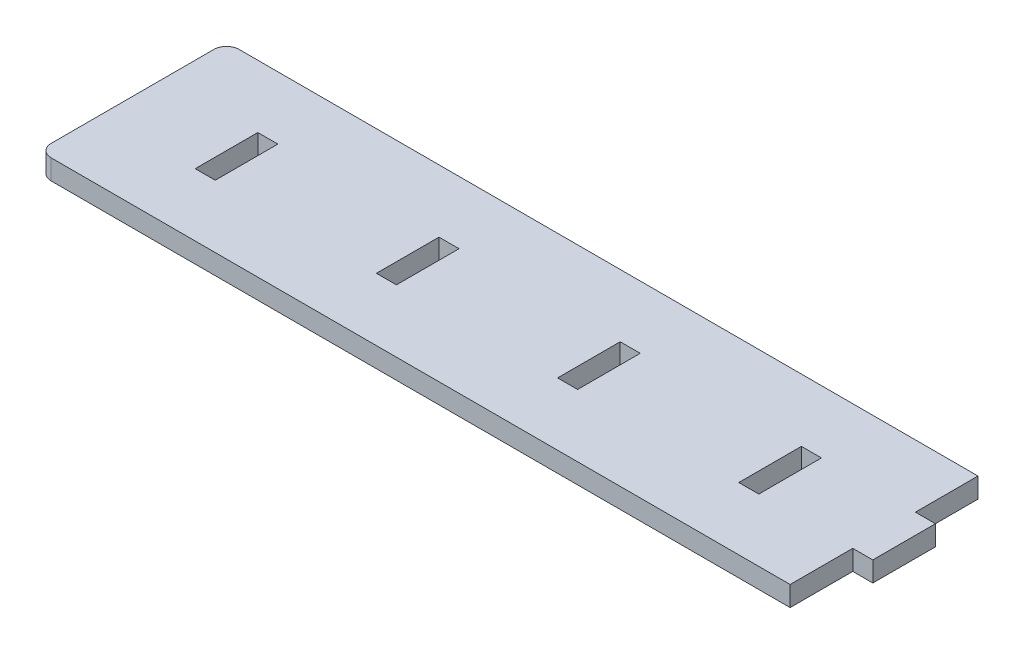
ISO-10303-21;
HEADER;
FILE_DESCRIPTION(('STEP AP214'),'2;1');
FILE_NAME('part.step','',(''),(''),'','','');
FILE_SCHEMA(('AUTOMOTIVE_DESIGN { 1 0 10303 214 1 1 1 1 }'));
ENDSEC;
DATA;
#1=APPLICATION_CONTEXT('core data for automotive mechanical design processes');
#2=APPLICATION_PROTOCOL_DEFINITION('international standard','automotive_design',2000,#1);
#3=PRODUCT_CONTEXT('',#1,'mechanical');
#4=PRODUCT('Part','Part','',(#3));
#5=PRODUCT_RELATED_PRODUCT_CATEGORY('part','',(#4));
#6=PRODUCT_DEFINITION_FORMATION('','',#4);
#7=PRODUCT_DEFINITION_CONTEXT('part definition',#1,'design');
#8=PRODUCT_DEFINITION('design','',#6,#7);
#9=PRODUCT_DEFINITION_SHAPE('','',#8);
#10=(LENGTH_UNIT() NAMED_UNIT(*) SI_UNIT(.MILLI.,.METRE.));
#11=(NAMED_UNIT(*) PLANE_ANGLE_UNIT() SI_UNIT($,.RADIAN.));
#12=(NAMED_UNIT(*) SI_UNIT($,.STERADIAN.) SOLID_ANGLE_UNIT());
#13=UNCERTAINTY_MEASURE_WITH_UNIT(LENGTH_MEASURE(1.E-05),#10,'distance_accuracy_value','');
#14=(GEOMETRIC_REPRESENTATION_CONTEXT(3) GLOBAL_UNCERTAINTY_ASSIGNED_CONTEXT((#13)) GLOBAL_UNIT_ASSIGNED_CONTEXT((#10,
#11,#12)) REPRESENTATION_CONTEXT('',''));
#15=CARTESIAN_POINT('',(0.,0.,0.));
#16=DIRECTION('',(0.,0.,1.));
#17=DIRECTION('',(1.,0.,0.));
#18=AXIS2_PLACEMENT_3D('',#15,#16,#17);
#19=CARTESIAN_POINT('',(0.,3.2,0.));
#20=DIRECTION('',(0.,-1.,0.));
#21=DIRECTION('',(0.,0.,-1.));
#22=AXIS2_PLACEMENT_3D('',#19,#20,#21);
#23=PLANE('',#22);
#24=DIRECTION('',(1.,0.,0.));
#25=VECTOR('',#24,1.);
#26=CARTESIAN_POINT('',(-16.0666666666667,3.2,5.));
#27=LINE('',#26,#25);
#28=CARTESIAN_POINT('',(-16.0666666666667,3.2,5.));
#29=VERTEX_POINT('',#28);
#30=CARTESIAN_POINT('',(-12.8666666666667,3.2,5.));
#31=VERTEX_POINT('',#30);
#32=EDGE_CURVE('E252',#29,#31,#27,.T.);
#33=ORIENTED_EDGE('',*,*,#32,.F.);
#34=DIRECTION('',(0.,0.,1.));
#35=VECTOR('',#34,1.);
#36=CARTESIAN_POINT('',(-16.0666666666667,3.2,-5.));
#37=LINE('',#36,#35);
#38=CARTESIAN_POINT('',(-16.0666666666667,3.2,-5.));
#39=VERTEX_POINT('',#38);
#40=EDGE_CURVE('E260',#39,#29,#37,.T.);
#41=ORIENTED_EDGE('',*,*,#40,.F.);
#42=DIRECTION('',(-1.,0.,0.));
#43=VECTOR('',#42,1.);
#44=CARTESIAN_POINT('',(-16.0666666666667,3.2,-5.));
#45=LINE('',#44,#43);
#46=CARTESIAN_POINT('',(-12.8666666666667,3.2,-5.));
#47=VERTEX_POINT('',#46);
#48=EDGE_CURVE('E257',#47,#39,#45,.T.);
#49=ORIENTED_EDGE('',*,*,#48,.F.);
#50=DIRECTION('',(0.,0.,-1.));
#51=VECTOR('',#50,1.);
#52=CARTESIAN_POINT('',(-12.8666666666667,3.2,-5.));
#53=LINE('',#52,#51);
#54=EDGE_CURVE('E254',#31,#47,#53,.T.);
#55=ORIENTED_EDGE('',*,*,#54,.F.);
#56=EDGE_LOOP('',(#33,#41,#49,#55));
#57=FACE_BOUND('',#56,.T.);
#58=DIRECTION('',(0.,0.,-1.));
#59=VECTOR('',#58,1.);
#60=CARTESIAN_POINT('',(-41.8,3.2,-5.));
#61=LINE('',#60,#59);
#62=CARTESIAN_POINT('',(-41.8,3.2,5.));
#63=VERTEX_POINT('',#62);
#64=CARTESIAN_POINT('',(-41.8,3.2,-5.));
#65=VERTEX_POINT('',#64);
#66=EDGE_CURVE('E314',#63,#65,#61,.T.);
#67=ORIENTED_EDGE('',*,*,#66,.F.);
#68=DIRECTION('',(1.,0.,0.));
#69=VECTOR('',#68,1.);
#70=CARTESIAN_POINT('',(-45.,3.2,5.));
#71=LINE('',#70,#69);
#72=CARTESIAN_POINT('',(-45.,3.2,5.));
#73=VERTEX_POINT('',#72);
#74=EDGE_CURVE('E322',#73,#63,#71,.T.);
#75=ORIENTED_EDGE('',*,*,#74,.F.);
#76=DIRECTION('',(0.,0.,1.));
#77=VECTOR('',#76,1.);
#78=CARTESIAN_POINT('',(-45.,3.2,-5.));
#79=LINE('',#78,#77);
#80=CARTESIAN_POINT('',(-45.,3.2,-5.));
#81=VERTEX_POINT('',#80);
#82=EDGE_CURVE('E319',#81,#73,#79,.T.);
#83=ORIENTED_EDGE('',*,*,#82,.F.);
#84=DIRECTION('',(-1.,0.,0.));
#85=VECTOR('',#84,1.);
#86=CARTESIAN_POINT('',(-45.,3.2,-5.));
#87=LINE('',#86,#85);
#88=EDGE_CURVE('E316',#65,#81,#87,.T.);
#89=ORIENTED_EDGE('',*,*,#88,.F.);
#90=EDGE_LOOP('',(#67,#75,#83,#89));
#91=FACE_BOUND('',#90,.T.);
#92=DIRECTION('',(-1.,0.,0.));
#93=VECTOR('',#92,1.);
#94=CARTESIAN_POINT('',(-60.,3.2,-15.));
#95=LINE('',#94,#93);
#96=CARTESIAN_POINT('',(60.,3.2,-15.));
#97=VERTEX_POINT('',#96);
#98=CARTESIAN_POINT('',(-58.,3.2,-15.));
#99=VERTEX_POINT('',#98);
#100=EDGE_CURVE('E357',#97,#99,#95,.T.);
#101=ORIENTED_EDGE('',*,*,#100,.T.);
#102=CARTESIAN_POINT('',(-58.,3.2,-13.));
#103=DIRECTION('',(0.,-1.,0.));
#104=DIRECTION('',(0.,0.,-1.));
#105=AXIS2_PLACEMENT_3D('',#102,#103,#104);
#106=CIRCLE('',#105,2.);
#107=CARTESIAN_POINT('',(-60.,3.2,-13.));
#108=VERTEX_POINT('',#107);
#109=EDGE_CURVE('E42',#99,#108,#106,.F.);
#110=ORIENTED_EDGE('',*,*,#109,.T.);
#111=DIRECTION('',(0.,0.,1.));
#112=VECTOR('',#111,1.);
#113=CARTESIAN_POINT('',(-60.,3.2,-15.));
#114=LINE('',#113,#112);
#115=CARTESIAN_POINT('',(-60.,3.2,13.));
#116=VERTEX_POINT('',#115);
#117=EDGE_CURVE('E359',#108,#116,#114,.T.);
#118=ORIENTED_EDGE('',*,*,#117,.T.);
#119=CARTESIAN_POINT('',(-58.,3.2,13.));
#120=DIRECTION('',(0.,-1.,0.));
#121=DIRECTION('',(0.,0.,-1.));
#122=AXIS2_PLACEMENT_3D('',#119,#120,#121);
#123=CIRCLE('',#122,2.);
#124=CARTESIAN_POINT('',(-58.,3.2,15.));
#125=VERTEX_POINT('',#124);
#126=EDGE_CURVE('E49',#116,#125,#123,.F.);
#127=ORIENTED_EDGE('',*,*,#126,.T.);
#128=DIRECTION('',(1.,0.,0.));
#129=VECTOR('',#128,1.);
#130=CARTESIAN_POINT('',(-60.,3.2,15.));
#131=LINE('',#130,#129);
#132=CARTESIAN_POINT('',(60.,3.2,15.));
#133=VERTEX_POINT('',#132);
#134=EDGE_CURVE('E361',#125,#133,#131,.T.);
#135=ORIENTED_EDGE('',*,*,#134,.T.);
#136=DIRECTION('',(0.,0.,-1.));
#137=VECTOR('',#136,1.);
#138=CARTESIAN_POINT('',(60.,3.2,15.));
#139=LINE('',#138,#137);
#140=CARTESIAN_POINT('',(60.,3.2,4.99999999999999));
#141=VERTEX_POINT('',#140);
#142=EDGE_CURVE('E345',#133,#141,#139,.T.);
#143=ORIENTED_EDGE('',*,*,#142,.T.);
#144=DIRECTION('',(1.,0.,0.));
#145=VECTOR('',#144,1.);
#146=CARTESIAN_POINT('',(60.,3.2,4.99999999999999));
#147=LINE('',#146,#145);
#148=CARTESIAN_POINT('',(63.2,3.2,4.99999999999999));
#149=VERTEX_POINT('',#148);
#150=EDGE_CURVE('E348',#141,#149,#147,.T.);
#151=ORIENTED_EDGE('',*,*,#150,.T.);
#152=DIRECTION('',(0.,0.,-1.));
#153=VECTOR('',#152,1.);
#154=CARTESIAN_POINT('',(63.2,3.2,4.99999999999999));
#155=LINE('',#154,#153);
#156=CARTESIAN_POINT('',(63.2,3.2,-5.00000000000001));
#157=VERTEX_POINT('',#156);
#158=EDGE_CURVE('E351',#149,#157,#155,.T.);
#159=ORIENTED_EDGE('',*,*,#158,.T.);
#160=DIRECTION('',(-1.,0.,0.));
#161=VECTOR('',#160,1.);
#162=CARTESIAN_POINT('',(63.2,3.2,-5.00000000000001));
#163=LINE('',#162,#161);
#164=CARTESIAN_POINT('',(60.,3.2,-5.00000000000001));
#165=VERTEX_POINT('',#164);
#166=EDGE_CURVE('E353',#157,#165,#163,.T.);
#167=ORIENTED_EDGE('',*,*,#166,.T.);
#168=DIRECTION('',(0.,0.,-1.));
#169=VECTOR('',#168,1.);
#170=CARTESIAN_POINT('',(60.,3.2,-5.00000000000001));
#171=LINE('',#170,#169);
#172=EDGE_CURVE('E355',#165,#97,#171,.T.);
#173=ORIENTED_EDGE('',*,*,#172,.T.);
#174=EDGE_LOOP('',(#101,#110,#118,#127,#135,#143,#151,#159,#167,#173));
#175=FACE_BOUND('',#174,.T.);
#176=DIRECTION('',(1.,0.,0.));
#177=VECTOR('',#176,1.);
#178=CARTESIAN_POINT('',(12.8666666666666,3.2,5.));
#179=LINE('',#178,#177);
#180=CARTESIAN_POINT('',(12.8666666666666,3.2,5.));
#181=VERTEX_POINT('',#180);
#182=CARTESIAN_POINT('',(16.0666666666666,3.2,5.));
#183=VERTEX_POINT('',#182);
#184=EDGE_CURVE('E283',#181,#183,#179,.T.);
#185=ORIENTED_EDGE('',*,*,#184,.F.);
#186=DIRECTION('',(0.,0.,1.));
#187=VECTOR('',#186,1.);
#188=CARTESIAN_POINT('',(12.8666666666666,3.2,-5.));
#189=LINE('',#188,#187);
#190=CARTESIAN_POINT('',(12.8666666666666,3.2,-5.));
#191=VERTEX_POINT('',#190);
#192=EDGE_CURVE('E291',#191,#181,#189,.T.);
#193=ORIENTED_EDGE('',*,*,#192,.F.);
#194=DIRECTION('',(-1.,0.,0.));
#195=VECTOR('',#194,1.);
#196=CARTESIAN_POINT('',(12.8666666666666,3.2,-5.));
#197=LINE('',#196,#195);
#198=CARTESIAN_POINT('',(16.0666666666666,3.2,-5.));
#199=VERTEX_POINT('',#198);
#200=EDGE_CURVE('E288',#199,#191,#197,.T.);
#201=ORIENTED_EDGE('',*,*,#200,.F.);
#202=DIRECTION('',(0.,0.,-1.));
#203=VECTOR('',#202,1.);
#204=CARTESIAN_POINT('',(16.0666666666666,3.2,-5.));
#205=LINE('',#204,#203);
#206=EDGE_CURVE('E285',#183,#199,#205,.T.);
#207=ORIENTED_EDGE('',*,*,#206,.F.);
#208=EDGE_LOOP('',(#185,#193,#201,#207));
#209=FACE_BOUND('',#208,.T.);
#210=DIRECTION('',(1.,0.,0.));
#211=VECTOR('',#210,1.);
#212=CARTESIAN_POINT('',(41.8,3.2,5.));
#213=LINE('',#212,#211);
#214=CARTESIAN_POINT('',(41.8,3.2,5.));
#215=VERTEX_POINT('',#214);
#216=CARTESIAN_POINT('',(45.,3.2,5.));
#217=VERTEX_POINT('',#216);
#218=EDGE_CURVE('E211',#215,#217,#213,.T.);
#219=ORIENTED_EDGE('',*,*,#218,.F.);
#220=DIRECTION('',(0.,0.,1.));
#221=VECTOR('',#220,1.);
#222=CARTESIAN_POINT('',(41.8,3.2,-5.));
#223=LINE('',#222,#221);
#224=CARTESIAN_POINT('',(41.8,3.2,-5.));
#225=VERTEX_POINT('',#224);
#226=EDGE_CURVE('E236',#225,#215,#223,.T.);
#227=ORIENTED_EDGE('',*,*,#226,.F.);
#228=DIRECTION('',(-1.,0.,0.));
#229=VECTOR('',#228,1.);
#230=CARTESIAN_POINT('',(41.8,3.2,-5.));
#231=LINE('',#230,#229);
#232=CARTESIAN_POINT('',(45.,3.2,-5.00000000000002));
#233=VERTEX_POINT('',#232);
#234=EDGE_CURVE('E234',#233,#225,#231,.T.);
#235=ORIENTED_EDGE('',*,*,#234,.F.);
#236=DIRECTION('',(0.,0.,-1.));
#237=VECTOR('',#236,1.);
#238=CARTESIAN_POINT('',(45.,3.2,-5.00000000000002));
#239=LINE('',#238,#237);
#240=EDGE_CURVE('E221',#217,#233,#239,.T.);
#241=ORIENTED_EDGE('',*,*,#240,.F.);
#242=EDGE_LOOP('',(#219,#227,#235,#241));
#243=FACE_BOUND('',#242,.T.);
#244=ADVANCED_FACE('F34',(#57,#91,#175,#209,#243),#23,.F.);
#245=CARTESIAN_POINT('',(0.,0.,0.));
#246=DIRECTION('',(0.,-1.,0.));
#247=DIRECTION('',(0.,0.,-1.));
#248=AXIS2_PLACEMENT_3D('',#245,#246,#247);
#249=PLANE('',#248);
#250=DIRECTION('',(0.,0.,1.));
#251=VECTOR('',#250,1.);
#252=CARTESIAN_POINT('',(-60.,0.,-15.));
#253=LINE('',#252,#251);
#254=CARTESIAN_POINT('',(-60.,0.,-13.));
#255=VERTEX_POINT('',#254);
#256=CARTESIAN_POINT('',(-60.,0.,13.));
#257=VERTEX_POINT('',#256);
#258=EDGE_CURVE('E376',#255,#257,#253,.T.);
#259=ORIENTED_EDGE('',*,*,#258,.F.);
#260=CARTESIAN_POINT('',(-58.,0.,-13.));
#261=DIRECTION('',(0.,-1.,0.));
#262=DIRECTION('',(0.,0.,-1.));
#263=AXIS2_PLACEMENT_3D('',#260,#261,#262);
#264=CIRCLE('',#263,2.);
#265=CARTESIAN_POINT('',(-58.,0.,-15.));
#266=VERTEX_POINT('',#265);
#267=EDGE_CURVE('E404',#255,#266,#264,.T.);
#268=ORIENTED_EDGE('',*,*,#267,.T.);
#269=DIRECTION('',(-1.,0.,0.));
#270=VECTOR('',#269,1.);
#271=CARTESIAN_POINT('',(-60.,0.,-15.));
#272=LINE('',#271,#270);
#273=CARTESIAN_POINT('',(60.,0.,-15.));
#274=VERTEX_POINT('',#273);
#275=EDGE_CURVE('E374',#274,#266,#272,.T.);
#276=ORIENTED_EDGE('',*,*,#275,.F.);
#277=DIRECTION('',(0.,0.,-1.));
#278=VECTOR('',#277,1.);
#279=CARTESIAN_POINT('',(60.,0.,-5.00000000000001));
#280=LINE('',#279,#278);
#281=CARTESIAN_POINT('',(60.,0.,-5.00000000000001));
#282=VERTEX_POINT('',#281);
#283=EDGE_CURVE('E372',#282,#274,#280,.T.);
#284=ORIENTED_EDGE('',*,*,#283,.F.);
#285=DIRECTION('',(-1.,0.,0.));
#286=VECTOR('',#285,1.);
#287=CARTESIAN_POINT('',(63.2,0.,-5.00000000000001));
#288=LINE('',#287,#286);
#289=CARTESIAN_POINT('',(63.2,0.,-5.00000000000001));
#290=VERTEX_POINT('',#289);
#291=EDGE_CURVE('E370',#290,#282,#288,.T.);
#292=ORIENTED_EDGE('',*,*,#291,.F.);
#293=DIRECTION('',(0.,0.,-1.));
#294=VECTOR('',#293,1.);
#295=CARTESIAN_POINT('',(63.2,0.,4.99999999999999));
#296=LINE('',#295,#294);
#297=CARTESIAN_POINT('',(63.2,0.,4.99999999999999));
#298=VERTEX_POINT('',#297);
#299=EDGE_CURVE('E368',#298,#290,#296,.T.);
#300=ORIENTED_EDGE('',*,*,#299,.F.);
#301=DIRECTION('',(1.,0.,0.));
#302=VECTOR('',#301,1.);
#303=CARTESIAN_POINT('',(60.,0.,4.99999999999999));
#304=LINE('',#303,#302);
#305=CARTESIAN_POINT('',(60.,0.,4.99999999999999));
#306=VERTEX_POINT('',#305);
#307=EDGE_CURVE('E366',#306,#298,#304,.T.);
#308=ORIENTED_EDGE('',*,*,#307,.F.);
#309=DIRECTION('',(0.,0.,-1.));
#310=VECTOR('',#309,1.);
#311=CARTESIAN_POINT('',(60.,0.,15.));
#312=LINE('',#311,#310);
#313=CARTESIAN_POINT('',(60.,0.,15.));
#314=VERTEX_POINT('',#313);
#315=EDGE_CURVE('E344',#314,#306,#312,.T.);
#316=ORIENTED_EDGE('',*,*,#315,.F.);
#317=DIRECTION('',(1.,0.,0.));
#318=VECTOR('',#317,1.);
#319=CARTESIAN_POINT('',(-60.,0.,15.));
#320=LINE('',#319,#318);
#321=CARTESIAN_POINT('',(-58.,0.,15.));
#322=VERTEX_POINT('',#321);
#323=EDGE_CURVE('E349',#322,#314,#320,.T.);
#324=ORIENTED_EDGE('',*,*,#323,.F.);
#325=CARTESIAN_POINT('',(-58.,0.,13.));
#326=DIRECTION('',(0.,-1.,0.));
#327=DIRECTION('',(0.,0.,-1.));
#328=AXIS2_PLACEMENT_3D('',#325,#326,#327);
#329=CIRCLE('',#328,2.);
#330=EDGE_CURVE('E402',#322,#257,#329,.T.);
#331=ORIENTED_EDGE('',*,*,#330,.T.);
#332=EDGE_LOOP('',(#259,#268,#276,#284,#292,#300,#308,#316,#324,#331));
#333=FACE_BOUND('',#332,.T.);
#334=DIRECTION('',(1.,0.,0.));
#335=VECTOR('',#334,1.);
#336=CARTESIAN_POINT('',(-45.,0.,5.));
#337=LINE('',#336,#335);
#338=CARTESIAN_POINT('',(-45.,0.,5.));
#339=VERTEX_POINT('',#338);
#340=CARTESIAN_POINT('',(-41.8,0.,5.));
#341=VERTEX_POINT('',#340);
#342=EDGE_CURVE('E317',#339,#341,#337,.T.);
#343=ORIENTED_EDGE('',*,*,#342,.T.);
#344=DIRECTION('',(0.,0.,-1.));
#345=VECTOR('',#344,1.);
#346=CARTESIAN_POINT('',(-41.8,0.,-5.));
#347=LINE('',#346,#345);
#348=CARTESIAN_POINT('',(-41.8,0.,-5.));
#349=VERTEX_POINT('',#348);
#350=EDGE_CURVE('E313',#341,#349,#347,.T.);
#351=ORIENTED_EDGE('',*,*,#350,.T.);
#352=DIRECTION('',(-1.,0.,0.));
#353=VECTOR('',#352,1.);
#354=CARTESIAN_POINT('',(-45.,0.,-5.));
#355=LINE('',#354,#353);
#356=CARTESIAN_POINT('',(-45.,0.,-5.));
#357=VERTEX_POINT('',#356);
#358=EDGE_CURVE('E327',#349,#357,#355,.T.);
#359=ORIENTED_EDGE('',*,*,#358,.T.);
#360=DIRECTION('',(0.,0.,1.));
#361=VECTOR('',#360,1.);
#362=CARTESIAN_POINT('',(-45.,0.,-5.));
#363=LINE('',#362,#361);
#364=EDGE_CURVE('E330',#357,#339,#363,.T.);
#365=ORIENTED_EDGE('',*,*,#364,.T.);
#366=EDGE_LOOP('',(#343,#351,#359,#365));
#367=FACE_BOUND('',#366,.T.);
#368=DIRECTION('',(0.,0.,1.));
#369=VECTOR('',#368,1.);
#370=CARTESIAN_POINT('',(12.8666666666666,0.,-5.));
#371=LINE('',#370,#369);
#372=CARTESIAN_POINT('',(12.8666666666666,0.,-5.));
#373=VERTEX_POINT('',#372);
#374=CARTESIAN_POINT('',(12.8666666666666,0.,5.));
#375=VERTEX_POINT('',#374);
#376=EDGE_CURVE('E286',#373,#375,#371,.T.);
#377=ORIENTED_EDGE('',*,*,#376,.T.);
#378=DIRECTION('',(1.,0.,0.));
#379=VECTOR('',#378,1.);
#380=CARTESIAN_POINT('',(12.8666666666666,0.,5.));
#381=LINE('',#380,#379);
#382=CARTESIAN_POINT('',(16.0666666666666,0.,5.));
#383=VERTEX_POINT('',#382);
#384=EDGE_CURVE('E282',#375,#383,#381,.T.);
#385=ORIENTED_EDGE('',*,*,#384,.T.);
#386=DIRECTION('',(0.,0.,-1.));
#387=VECTOR('',#386,1.);
#388=CARTESIAN_POINT('',(16.0666666666666,0.,-5.));
#389=LINE('',#388,#387);
#390=CARTESIAN_POINT('',(16.0666666666666,0.,-5.));
#391=VERTEX_POINT('',#390);
#392=EDGE_CURVE('E296',#383,#391,#389,.T.);
#393=ORIENTED_EDGE('',*,*,#392,.T.);
#394=DIRECTION('',(-1.,0.,0.));
#395=VECTOR('',#394,1.);
#396=CARTESIAN_POINT('',(12.8666666666666,0.,-5.));
#397=LINE('',#396,#395);
#398=EDGE_CURVE('E299',#391,#373,#397,.T.);
#399=ORIENTED_EDGE('',*,*,#398,.T.);
#400=EDGE_LOOP('',(#377,#385,#393,#399));
#401=FACE_BOUND('',#400,.T.);
#402=DIRECTION('',(0.,0.,1.));
#403=VECTOR('',#402,1.);
#404=CARTESIAN_POINT('',(-16.0666666666667,0.,-5.));
#405=LINE('',#404,#403);
#406=CARTESIAN_POINT('',(-16.0666666666667,0.,-5.));
#407=VERTEX_POINT('',#406);
#408=CARTESIAN_POINT('',(-16.0666666666667,0.,5.));
#409=VERTEX_POINT('',#408);
#410=EDGE_CURVE('E255',#407,#409,#405,.T.);
#411=ORIENTED_EDGE('',*,*,#410,.T.);
#412=DIRECTION('',(1.,0.,0.));
#413=VECTOR('',#412,1.);
#414=CARTESIAN_POINT('',(-16.0666666666667,0.,5.));
#415=LINE('',#414,#413);
#416=CARTESIAN_POINT('',(-12.8666666666667,0.,5.));
#417=VERTEX_POINT('',#416);
#418=EDGE_CURVE('E229',#409,#417,#415,.T.);
#419=ORIENTED_EDGE('',*,*,#418,.T.);
#420=DIRECTION('',(0.,0.,-1.));
#421=VECTOR('',#420,1.);
#422=CARTESIAN_POINT('',(-12.8666666666667,0.,-5.));
#423=LINE('',#422,#421);
#424=CARTESIAN_POINT('',(-12.8666666666667,0.,-5.));
#425=VERTEX_POINT('',#424);
#426=EDGE_CURVE('E265',#417,#425,#423,.T.);
#427=ORIENTED_EDGE('',*,*,#426,.T.);
#428=DIRECTION('',(-1.,0.,0.));
#429=VECTOR('',#428,1.);
#430=CARTESIAN_POINT('',(-16.0666666666667,0.,-5.));
#431=LINE('',#430,#429);
#432=EDGE_CURVE('E268',#425,#407,#431,.T.);
#433=ORIENTED_EDGE('',*,*,#432,.T.);
#434=EDGE_LOOP('',(#411,#419,#427,#433));
#435=FACE_BOUND('',#434,.T.);
#436=DIRECTION('',(0.,0.,1.));
#437=VECTOR('',#436,1.);
#438=CARTESIAN_POINT('',(41.8,0.,-5.));
#439=LINE('',#438,#437);
#440=CARTESIAN_POINT('',(41.8,0.,-5.));
#441=VERTEX_POINT('',#440);
#442=CARTESIAN_POINT('',(41.8,0.,5.));
#443=VERTEX_POINT('',#442);
#444=EDGE_CURVE('E222',#441,#443,#439,.T.);
#445=ORIENTED_EDGE('',*,*,#444,.T.);
#446=DIRECTION('',(1.,0.,0.));
#447=VECTOR('',#446,1.);
#448=CARTESIAN_POINT('',(41.8,0.,5.));
#449=LINE('',#448,#447);
#450=CARTESIAN_POINT('',(45.,0.,5.));
#451=VERTEX_POINT('',#450);
#452=EDGE_CURVE('E240',#443,#451,#449,.T.);
#453=ORIENTED_EDGE('',*,*,#452,.T.);
#454=DIRECTION('',(0.,0.,-1.));
#455=VECTOR('',#454,1.);
#456=CARTESIAN_POINT('',(45.,0.,-5.00000000000002));
#457=LINE('',#456,#455);
#458=CARTESIAN_POINT('',(45.,0.,-5.00000000000002));
#459=VERTEX_POINT('',#458);
#460=EDGE_CURVE('E228',#451,#459,#457,.T.);
#461=ORIENTED_EDGE('',*,*,#460,.T.);
#462=DIRECTION('',(-1.,0.,0.));
#463=VECTOR('',#462,1.);
#464=CARTESIAN_POINT('',(41.8,0.,-5.));
#465=LINE('',#464,#463);
#466=EDGE_CURVE('E243',#459,#441,#465,.T.);
#467=ORIENTED_EDGE('',*,*,#466,.T.);
#468=EDGE_LOOP('',(#445,#453,#461,#467));
#469=FACE_BOUND('',#468,.T.);
#470=ADVANCED_FACE('F419',(#333,#367,#401,#435,#469),#249,.T.);
#471=CARTESIAN_POINT('',(60.,3.2,15.));
#472=DIRECTION('',(-1.,0.,0.));
#473=DIRECTION('',(0.,0.,1.));
#474=AXIS2_PLACEMENT_3D('',#471,#472,#473);
#475=PLANE('',#474);
#476=ORIENTED_EDGE('',*,*,#315,.T.);
#477=DIRECTION('',(0.,-1.,0.));
#478=VECTOR('',#477,1.);
#479=CARTESIAN_POINT('',(60.,3.2,4.99999999999999));
#480=LINE('',#479,#478);
#481=EDGE_CURVE('E394',#141,#306,#480,.T.);
#482=ORIENTED_EDGE('',*,*,#481,.F.);
#483=ORIENTED_EDGE('',*,*,#142,.F.);
#484=DIRECTION('',(0.,-1.,0.));
#485=VECTOR('',#484,1.);
#486=CARTESIAN_POINT('',(60.,3.2,15.));
#487=LINE('',#486,#485);
#488=EDGE_CURVE('E363',#133,#314,#487,.T.);
#489=ORIENTED_EDGE('',*,*,#488,.T.);
#490=EDGE_LOOP('',(#476,#482,#483,#489));
#491=FACE_BOUND('',#490,.T.);
#492=ADVANCED_FACE('F444',(#491),#475,.F.);
#493=CARTESIAN_POINT('',(60.,3.2,4.99999999999999));
#494=DIRECTION('',(0.,0.,-1.));
#495=DIRECTION('',(-1.,0.,0.));
#496=AXIS2_PLACEMENT_3D('',#493,#494,#495);
#497=PLANE('',#496);
#498=ORIENTED_EDGE('',*,*,#307,.T.);
#499=DIRECTION('',(0.,-1.,0.));
#500=VECTOR('',#499,1.);
#501=CARTESIAN_POINT('',(63.2,3.2,4.99999999999999));
#502=LINE('',#501,#500);
#503=EDGE_CURVE('E391',#149,#298,#502,.T.);
#504=ORIENTED_EDGE('',*,*,#503,.F.);
#505=ORIENTED_EDGE('',*,*,#150,.F.);
#506=ORIENTED_EDGE('',*,*,#481,.T.);
#507=EDGE_LOOP('',(#498,#504,#505,#506));
#508=FACE_BOUND('',#507,.T.);
#509=ADVANCED_FACE('F439',(#508),#497,.F.);
#510=CARTESIAN_POINT('',(63.2,3.2,4.99999999999999));
#511=DIRECTION('',(-1.,0.,0.));
#512=DIRECTION('',(0.,0.,1.));
#513=AXIS2_PLACEMENT_3D('',#510,#511,#512);
#514=PLANE('',#513);
#515=ORIENTED_EDGE('',*,*,#299,.T.);
#516=DIRECTION('',(0.,-1.,0.));
#517=VECTOR('',#516,1.);
#518=CARTESIAN_POINT('',(63.2,3.2,-5.00000000000001));
#519=LINE('',#518,#517);
#520=EDGE_CURVE('E388',#157,#290,#519,.T.);
#521=ORIENTED_EDGE('',*,*,#520,.F.);
#522=ORIENTED_EDGE('',*,*,#158,.F.);
#523=ORIENTED_EDGE('',*,*,#503,.T.);
#524=EDGE_LOOP('',(#515,#521,#522,#523));
#525=FACE_BOUND('',#524,.T.);
#526=ADVANCED_FACE('F436',(#525),#514,.F.);
#527=CARTESIAN_POINT('',(63.2,3.2,-5.00000000000001));
#528=DIRECTION('',(0.,0.,1.));
#529=DIRECTION('',(1.,0.,0.));
#530=AXIS2_PLACEMENT_3D('',#527,#528,#529);
#531=PLANE('',#530);
#532=ORIENTED_EDGE('',*,*,#291,.T.);
#533=DIRECTION('',(0.,-1.,0.));
#534=VECTOR('',#533,1.);
#535=CARTESIAN_POINT('',(60.,3.2,-5.00000000000001));
#536=LINE('',#535,#534);
#537=EDGE_CURVE('E385',#165,#282,#536,.T.);
#538=ORIENTED_EDGE('',*,*,#537,.F.);
#539=ORIENTED_EDGE('',*,*,#166,.F.);
#540=ORIENTED_EDGE('',*,*,#520,.T.);
#541=EDGE_LOOP('',(#532,#538,#539,#540));
#542=FACE_BOUND('',#541,.T.);
#543=ADVANCED_FACE('F431',(#542),#531,.F.);
#544=CARTESIAN_POINT('',(60.,3.2,-5.00000000000001));
#545=DIRECTION('',(-1.,0.,0.));
#546=DIRECTION('',(0.,0.,1.));
#547=AXIS2_PLACEMENT_3D('',#544,#545,#546);
#548=PLANE('',#547);
#549=ORIENTED_EDGE('',*,*,#283,.T.);
#550=DIRECTION('',(0.,-1.,0.));
#551=VECTOR('',#550,1.);
#552=CARTESIAN_POINT('',(60.,3.2,-15.));
#553=LINE('',#552,#551);
#554=EDGE_CURVE('E382',#97,#274,#553,.T.);
#555=ORIENTED_EDGE('',*,*,#554,.F.);
#556=ORIENTED_EDGE('',*,*,#172,.F.);
#557=ORIENTED_EDGE('',*,*,#537,.T.);
#558=EDGE_LOOP('',(#549,#555,#556,#557));
#559=FACE_BOUND('',#558,.T.);
#560=ADVANCED_FACE('F426',(#559),#548,.F.);
#561=CARTESIAN_POINT('',(-60.,3.2,-15.));
#562=DIRECTION('',(0.,0.,1.));
#563=DIRECTION('',(1.,0.,0.));
#564=AXIS2_PLACEMENT_3D('',#561,#562,#563);
#565=PLANE('',#564);
#566=ORIENTED_EDGE('',*,*,#275,.T.);
#567=DIRECTION('',(0.,-1.,0.));
#568=VECTOR('',#567,1.);
#569=CARTESIAN_POINT('',(-58.,3.2,-15.));
#570=LINE('',#569,#568);
#571=EDGE_CURVE('E57',#266,#99,#570,.F.);
#572=ORIENTED_EDGE('',*,*,#571,.T.);
#573=ORIENTED_EDGE('',*,*,#100,.F.);
#574=ORIENTED_EDGE('',*,*,#554,.T.);
#575=EDGE_LOOP('',(#566,#572,#573,#574));
#576=FACE_BOUND('',#575,.T.);
#577=ADVANCED_FACE('F422',(#576),#565,.F.);
#578=CARTESIAN_POINT('',(-60.,3.2,-15.));
#579=DIRECTION('',(1.,0.,0.));
#580=DIRECTION('',(0.,0.,-1.));
#581=AXIS2_PLACEMENT_3D('',#578,#579,#580);
#582=PLANE('',#581);
#583=ORIENTED_EDGE('',*,*,#117,.F.);
#584=DIRECTION('',(0.,-1.,0.));
#585=VECTOR('',#584,1.);
#586=CARTESIAN_POINT('',(-60.,3.2,-13.));
#587=LINE('',#586,#585);
#588=EDGE_CURVE('E399',#108,#255,#587,.T.);
#589=ORIENTED_EDGE('',*,*,#588,.T.);
#590=ORIENTED_EDGE('',*,*,#258,.T.);
#591=DIRECTION('',(0.,-1.,0.));
#592=VECTOR('',#591,1.);
#593=CARTESIAN_POINT('',(-60.,3.2,13.));
#594=LINE('',#593,#592);
#595=EDGE_CURVE('E397',#257,#116,#594,.F.);
#596=ORIENTED_EDGE('',*,*,#595,.T.);
#597=EDGE_LOOP('',(#583,#589,#590,#596));
#598=FACE_BOUND('',#597,.T.);
#599=ADVANCED_FACE('F413',(#598),#582,.F.);
#600=CARTESIAN_POINT('',(-60.,3.2,15.));
#601=DIRECTION('',(0.,0.,-1.));
#602=DIRECTION('',(-1.,0.,0.));
#603=AXIS2_PLACEMENT_3D('',#600,#601,#602);
#604=PLANE('',#603);
#605=ORIENTED_EDGE('',*,*,#134,.F.);
#606=DIRECTION('',(0.,-1.,0.));
#607=VECTOR('',#606,1.);
#608=CARTESIAN_POINT('',(-58.,3.2,15.));
#609=LINE('',#608,#607);
#610=EDGE_CURVE('E11',#125,#322,#609,.T.);
#611=ORIENTED_EDGE('',*,*,#610,.T.);
#612=ORIENTED_EDGE('',*,*,#323,.T.);
#613=ORIENTED_EDGE('',*,*,#488,.F.);
#614=EDGE_LOOP('',(#605,#611,#612,#613));
#615=FACE_BOUND('',#614,.T.);
#616=ADVANCED_FACE('F448',(#615),#604,.F.);
#617=CARTESIAN_POINT('',(-41.8,3.2,-5.));
#618=DIRECTION('',(-1.,0.,0.));
#619=DIRECTION('',(0.,0.,1.));
#620=AXIS2_PLACEMENT_3D('',#617,#618,#619);
#621=PLANE('',#620);
#622=ORIENTED_EDGE('',*,*,#350,.F.);
#623=DIRECTION('',(0.,-1.,0.));
#624=VECTOR('',#623,1.);
#625=CARTESIAN_POINT('',(-41.8,3.2,5.));
#626=LINE('',#625,#624);
#627=EDGE_CURVE('E324',#63,#341,#626,.T.);
#628=ORIENTED_EDGE('',*,*,#627,.F.);
#629=ORIENTED_EDGE('',*,*,#66,.T.);
#630=DIRECTION('',(0.,-1.,0.));
#631=VECTOR('',#630,1.);
#632=CARTESIAN_POINT('',(-41.8,3.2,-5.));
#633=LINE('',#632,#631);
#634=EDGE_CURVE('E341',#65,#349,#633,.T.);
#635=ORIENTED_EDGE('',*,*,#634,.T.);
#636=EDGE_LOOP('',(#622,#628,#629,#635));
#637=FACE_BOUND('',#636,.T.);
#638=ADVANCED_FACE('F466',(#637),#621,.T.);
#639=CARTESIAN_POINT('',(-45.,3.2,-5.));
#640=DIRECTION('',(0.,0.,1.));
#641=DIRECTION('',(1.,0.,0.));
#642=AXIS2_PLACEMENT_3D('',#639,#640,#641);
#643=PLANE('',#642);
#644=ORIENTED_EDGE('',*,*,#358,.F.);
#645=ORIENTED_EDGE('',*,*,#634,.F.);
#646=ORIENTED_EDGE('',*,*,#88,.T.);
#647=DIRECTION('',(0.,-1.,0.));
#648=VECTOR('',#647,1.);
#649=CARTESIAN_POINT('',(-45.,3.2,-5.));
#650=LINE('',#649,#648);
#651=EDGE_CURVE('E339',#81,#357,#650,.T.);
#652=ORIENTED_EDGE('',*,*,#651,.T.);
#653=EDGE_LOOP('',(#644,#645,#646,#652));
#654=FACE_BOUND('',#653,.T.);
#655=ADVANCED_FACE('F523',(#654),#643,.T.);
#656=CARTESIAN_POINT('',(-45.,3.2,-5.));
#657=DIRECTION('',(1.,0.,0.));
#658=DIRECTION('',(0.,0.,-1.));
#659=AXIS2_PLACEMENT_3D('',#656,#657,#658);
#660=PLANE('',#659);
#661=ORIENTED_EDGE('',*,*,#364,.F.);
#662=ORIENTED_EDGE('',*,*,#651,.F.);
#663=ORIENTED_EDGE('',*,*,#82,.T.);
#664=DIRECTION('',(0.,-1.,0.));
#665=VECTOR('',#664,1.);
#666=CARTESIAN_POINT('',(-45.,3.2,5.));
#667=LINE('',#666,#665);
#668=EDGE_CURVE('E337',#73,#339,#667,.T.);
#669=ORIENTED_EDGE('',*,*,#668,.T.);
#670=EDGE_LOOP('',(#661,#662,#663,#669));
#671=FACE_BOUND('',#670,.T.);
#672=ADVANCED_FACE('F530',(#671),#660,.T.);
#673=CARTESIAN_POINT('',(-45.,3.2,5.));
#674=DIRECTION('',(0.,0.,-1.));
#675=DIRECTION('',(-1.,0.,0.));
#676=AXIS2_PLACEMENT_3D('',#673,#674,#675);
#677=PLANE('',#676);
#678=ORIENTED_EDGE('',*,*,#342,.F.);
#679=ORIENTED_EDGE('',*,*,#668,.F.);
#680=ORIENTED_EDGE('',*,*,#74,.T.);
#681=ORIENTED_EDGE('',*,*,#627,.T.);
#682=EDGE_LOOP('',(#678,#679,#680,#681));
#683=FACE_BOUND('',#682,.T.);
#684=ADVANCED_FACE('F537',(#683),#677,.T.);
#685=CARTESIAN_POINT('',(12.8666666666666,3.2,5.));
#686=DIRECTION('',(0.,0.,-1.));
#687=DIRECTION('',(-1.,0.,0.));
#688=AXIS2_PLACEMENT_3D('',#685,#686,#687);
#689=PLANE('',#688);
#690=ORIENTED_EDGE('',*,*,#384,.F.);
#691=DIRECTION('',(0.,-1.,0.));
#692=VECTOR('',#691,1.);
#693=CARTESIAN_POINT('',(12.8666666666666,3.2,5.));
#694=LINE('',#693,#692);
#695=EDGE_CURVE('E293',#181,#375,#694,.T.);
#696=ORIENTED_EDGE('',*,*,#695,.F.);
#697=ORIENTED_EDGE('',*,*,#184,.T.);
#698=DIRECTION('',(0.,-1.,0.));
#699=VECTOR('',#698,1.);
#700=CARTESIAN_POINT('',(16.0666666666666,3.2,5.));
#701=LINE('',#700,#699);
#702=EDGE_CURVE('E310',#183,#383,#701,.T.);
#703=ORIENTED_EDGE('',*,*,#702,.T.);
#704=EDGE_LOOP('',(#690,#696,#697,#703));
#705=FACE_BOUND('',#704,.T.);
#706=ADVANCED_FACE('F545',(#705),#689,.T.);
#707=CARTESIAN_POINT('',(16.0666666666666,3.2,-5.));
#708=DIRECTION('',(-1.,0.,0.));
#709=DIRECTION('',(0.,0.,1.));
#710=AXIS2_PLACEMENT_3D('',#707,#708,#709);
#711=PLANE('',#710);
#712=ORIENTED_EDGE('',*,*,#392,.F.);
#713=ORIENTED_EDGE('',*,*,#702,.F.);
#714=ORIENTED_EDGE('',*,*,#206,.T.);
#715=DIRECTION('',(0.,-1.,0.));
#716=VECTOR('',#715,1.);
#717=CARTESIAN_POINT('',(16.0666666666666,3.2,-5.));
#718=LINE('',#717,#716);
#719=EDGE_CURVE('E308',#199,#391,#718,.T.);
#720=ORIENTED_EDGE('',*,*,#719,.T.);
#721=EDGE_LOOP('',(#712,#713,#714,#720));
#722=FACE_BOUND('',#721,.T.);
#723=ADVANCED_FACE('F553',(#722),#711,.T.);
#724=CARTESIAN_POINT('',(12.8666666666666,3.2,-5.));
#725=DIRECTION('',(0.,0.,1.));
#726=DIRECTION('',(1.,0.,0.));
#727=AXIS2_PLACEMENT_3D('',#724,#725,#726);
#728=PLANE('',#727);
#729=ORIENTED_EDGE('',*,*,#398,.F.);
#730=ORIENTED_EDGE('',*,*,#719,.F.);
#731=ORIENTED_EDGE('',*,*,#200,.T.);
#732=DIRECTION('',(0.,-1.,0.));
#733=VECTOR('',#732,1.);
#734=CARTESIAN_POINT('',(12.8666666666666,3.2,-5.));
#735=LINE('',#734,#733);
#736=EDGE_CURVE('E306',#191,#373,#735,.T.);
#737=ORIENTED_EDGE('',*,*,#736,.T.);
#738=EDGE_LOOP('',(#729,#730,#731,#737));
#739=FACE_BOUND('',#738,.T.);
#740=ADVANCED_FACE('F561',(#739),#728,.T.);
#741=CARTESIAN_POINT('',(12.8666666666666,3.2,-5.));
#742=DIRECTION('',(1.,0.,0.));
#743=DIRECTION('',(0.,0.,-1.));
#744=AXIS2_PLACEMENT_3D('',#741,#742,#743);
#745=PLANE('',#744);
#746=ORIENTED_EDGE('',*,*,#376,.F.);
#747=ORIENTED_EDGE('',*,*,#736,.F.);
#748=ORIENTED_EDGE('',*,*,#192,.T.);
#749=ORIENTED_EDGE('',*,*,#695,.T.);
#750=EDGE_LOOP('',(#746,#747,#748,#749));
#751=FACE_BOUND('',#750,.T.);
#752=ADVANCED_FACE('F569',(#751),#745,.T.);
#753=CARTESIAN_POINT('',(-16.0666666666667,3.2,5.));
#754=DIRECTION('',(0.,0.,-1.));
#755=DIRECTION('',(-1.,0.,0.));
#756=AXIS2_PLACEMENT_3D('',#753,#754,#755);
#757=PLANE('',#756);
#758=ORIENTED_EDGE('',*,*,#418,.F.);
#759=DIRECTION('',(0.,-1.,0.));
#760=VECTOR('',#759,1.);
#761=CARTESIAN_POINT('',(-16.0666666666667,3.2,5.));
#762=LINE('',#761,#760);
#763=EDGE_CURVE('E262',#29,#409,#762,.T.);
#764=ORIENTED_EDGE('',*,*,#763,.F.);
#765=ORIENTED_EDGE('',*,*,#32,.T.);
#766=DIRECTION('',(0.,-1.,0.));
#767=VECTOR('',#766,1.);
#768=CARTESIAN_POINT('',(-12.8666666666667,3.2,5.));
#769=LINE('',#768,#767);
#770=EDGE_CURVE('E279',#31,#417,#769,.T.);
#771=ORIENTED_EDGE('',*,*,#770,.T.);
#772=EDGE_LOOP('',(#758,#764,#765,#771));
#773=FACE_BOUND('',#772,.T.);
#774=ADVANCED_FACE('F577',(#773),#757,.T.);
#775=CARTESIAN_POINT('',(-12.8666666666667,3.2,-5.));
#776=DIRECTION('',(-1.,0.,0.));
#777=DIRECTION('',(0.,0.,1.));
#778=AXIS2_PLACEMENT_3D('',#775,#776,#777);
#779=PLANE('',#778);
#780=ORIENTED_EDGE('',*,*,#426,.F.);
#781=ORIENTED_EDGE('',*,*,#770,.F.);
#782=ORIENTED_EDGE('',*,*,#54,.T.);
#783=DIRECTION('',(0.,-1.,0.));
#784=VECTOR('',#783,1.);
#785=CARTESIAN_POINT('',(-12.8666666666667,3.2,-5.));
#786=LINE('',#785,#784);
#787=EDGE_CURVE('E277',#47,#425,#786,.T.);
#788=ORIENTED_EDGE('',*,*,#787,.T.);
#789=EDGE_LOOP('',(#780,#781,#782,#788));
#790=FACE_BOUND('',#789,.T.);
#791=ADVANCED_FACE('F585',(#790),#779,.T.);
#792=CARTESIAN_POINT('',(-16.0666666666667,3.2,-5.));
#793=DIRECTION('',(0.,0.,1.));
#794=DIRECTION('',(1.,0.,0.));
#795=AXIS2_PLACEMENT_3D('',#792,#793,#794);
#796=PLANE('',#795);
#797=ORIENTED_EDGE('',*,*,#432,.F.);
#798=ORIENTED_EDGE('',*,*,#787,.F.);
#799=ORIENTED_EDGE('',*,*,#48,.T.);
#800=DIRECTION('',(0.,-1.,0.));
#801=VECTOR('',#800,1.);
#802=CARTESIAN_POINT('',(-16.0666666666667,3.2,-5.));
#803=LINE('',#802,#801);
#804=EDGE_CURVE('E275',#39,#407,#803,.T.);
#805=ORIENTED_EDGE('',*,*,#804,.T.);
#806=EDGE_LOOP('',(#797,#798,#799,#805));
#807=FACE_BOUND('',#806,.T.);
#808=ADVANCED_FACE('F593',(#807),#796,.T.);
#809=CARTESIAN_POINT('',(-16.0666666666667,3.2,-5.));
#810=DIRECTION('',(1.,0.,0.));
#811=DIRECTION('',(0.,0.,-1.));
#812=AXIS2_PLACEMENT_3D('',#809,#810,#811);
#813=PLANE('',#812);
#814=ORIENTED_EDGE('',*,*,#410,.F.);
#815=ORIENTED_EDGE('',*,*,#804,.F.);
#816=ORIENTED_EDGE('',*,*,#40,.T.);
#817=ORIENTED_EDGE('',*,*,#763,.T.);
#818=EDGE_LOOP('',(#814,#815,#816,#817));
#819=FACE_BOUND('',#818,.T.);
#820=ADVANCED_FACE('F601',(#819),#813,.T.);
#821=CARTESIAN_POINT('',(41.8,3.2,5.));
#822=DIRECTION('',(0.,0.,-1.));
#823=DIRECTION('',(-1.,0.,0.));
#824=AXIS2_PLACEMENT_3D('',#821,#822,#823);
#825=PLANE('',#824);
#826=ORIENTED_EDGE('',*,*,#452,.F.);
#827=DIRECTION('',(0.,-1.,0.));
#828=VECTOR('',#827,1.);
#829=CARTESIAN_POINT('',(41.8,3.2,5.));
#830=LINE('',#829,#828);
#831=EDGE_CURVE('E217',#215,#443,#830,.T.);
#832=ORIENTED_EDGE('',*,*,#831,.F.);
#833=ORIENTED_EDGE('',*,*,#218,.T.);
#834=DIRECTION('',(0.,-1.,0.));
#835=VECTOR('',#834,1.);
#836=CARTESIAN_POINT('',(45.,3.2,5.));
#837=LINE('',#836,#835);
#838=EDGE_CURVE('E214',#217,#451,#837,.T.);
#839=ORIENTED_EDGE('',*,*,#838,.T.);
#840=EDGE_LOOP('',(#826,#832,#833,#839));
#841=FACE_BOUND('',#840,.T.);
#842=ADVANCED_FACE('F213',(#841),#825,.T.);
#843=CARTESIAN_POINT('',(45.,3.2,-5.00000000000002));
#844=DIRECTION('',(-1.,0.,0.));
#845=DIRECTION('',(0.,0.,1.));
#846=AXIS2_PLACEMENT_3D('',#843,#844,#845);
#847=PLANE('',#846);
#848=ORIENTED_EDGE('',*,*,#460,.F.);
#849=ORIENTED_EDGE('',*,*,#838,.F.);
#850=ORIENTED_EDGE('',*,*,#240,.T.);
#851=DIRECTION('',(0.,-1.,0.));
#852=VECTOR('',#851,1.);
#853=CARTESIAN_POINT('',(45.,3.2,-5.00000000000002));
#854=LINE('',#853,#852);
#855=EDGE_CURVE('E230',#233,#459,#854,.T.);
#856=ORIENTED_EDGE('',*,*,#855,.T.);
#857=EDGE_LOOP('',(#848,#849,#850,#856));
#858=FACE_BOUND('',#857,.T.);
#859=ADVANCED_FACE('F225',(#858),#847,.T.);
#860=CARTESIAN_POINT('',(41.8,3.2,-5.));
#861=DIRECTION('',(0.,0.,1.));
#862=DIRECTION('',(1.,0.,0.));
#863=AXIS2_PLACEMENT_3D('',#860,#861,#862);
#864=PLANE('',#863);
#865=ORIENTED_EDGE('',*,*,#466,.F.);
#866=ORIENTED_EDGE('',*,*,#855,.F.);
#867=ORIENTED_EDGE('',*,*,#234,.T.);
#868=DIRECTION('',(0.,-1.,0.));
#869=VECTOR('',#868,1.);
#870=CARTESIAN_POINT('',(41.8,3.2,-5.));
#871=LINE('',#870,#869);
#872=EDGE_CURVE('E249',#225,#441,#871,.T.);
#873=ORIENTED_EDGE('',*,*,#872,.T.);
#874=EDGE_LOOP('',(#865,#866,#867,#873));
#875=FACE_BOUND('',#874,.T.);
#876=ADVANCED_FACE('F622',(#875),#864,.T.);
#877=CARTESIAN_POINT('',(41.8,3.2,-5.));
#878=DIRECTION('',(1.,0.,0.));
#879=DIRECTION('',(0.,0.,-1.));
#880=AXIS2_PLACEMENT_3D('',#877,#878,#879);
#881=PLANE('',#880);
#882=ORIENTED_EDGE('',*,*,#444,.F.);
#883=ORIENTED_EDGE('',*,*,#872,.F.);
#884=ORIENTED_EDGE('',*,*,#226,.T.);
#885=ORIENTED_EDGE('',*,*,#831,.T.);
#886=EDGE_LOOP('',(#882,#883,#884,#885));
#887=FACE_BOUND('',#886,.T.);
#888=ADVANCED_FACE('F455',(#887),#881,.T.);
#889=CARTESIAN_POINT('',(-58.,3.2,-13.));
#890=DIRECTION('',(0.,-1.,0.));
#891=DIRECTION('',(0.,0.,-1.));
#892=AXIS2_PLACEMENT_3D('',#889,#890,#891);
#893=CYLINDRICAL_SURFACE('',#892,2.);
#894=ORIENTED_EDGE('',*,*,#109,.F.);
#895=ORIENTED_EDGE('',*,*,#571,.F.);
#896=ORIENTED_EDGE('',*,*,#267,.F.);
#897=ORIENTED_EDGE('',*,*,#588,.F.);
#898=EDGE_LOOP('',(#894,#895,#896,#897));
#899=FACE_BOUND('',#898,.T.);
#900=ADVANCED_FACE('F416',(#899),#893,.T.);
#901=CARTESIAN_POINT('',(-58.,3.2,13.));
#902=DIRECTION('',(0.,-1.,0.));
#903=DIRECTION('',(0.,0.,-1.));
#904=AXIS2_PLACEMENT_3D('',#901,#902,#903);
#905=CYLINDRICAL_SURFACE('',#904,2.);
#906=ORIENTED_EDGE('',*,*,#126,.F.);
#907=ORIENTED_EDGE('',*,*,#595,.F.);
#908=ORIENTED_EDGE('',*,*,#330,.F.);
#909=ORIENTED_EDGE('',*,*,#610,.F.);
#910=EDGE_LOOP('',(#906,#907,#908,#909));
#911=FACE_BOUND('',#910,.T.);
#912=ADVANCED_FACE('F36',(#911),#905,.T.);
#913=CLOSED_SHELL('',(#244,#470,#492,#509,#526,#543,#560,#577,#599,#616,#638,#655,#672,#684,
#706,#723,#740,#752,#774,#791,#808,#820,#842,#859,#876,#888,#900,#912));
#914=MANIFOLD_SOLID_BREP('B2',#913);
#915=ADVANCED_BREP_SHAPE_REPRESENTATION('',(#18,#914),#14);
#916=SHAPE_DEFINITION_REPRESENTATION(#9,#915);
ENDSEC;
END-ISO-10303-21;
